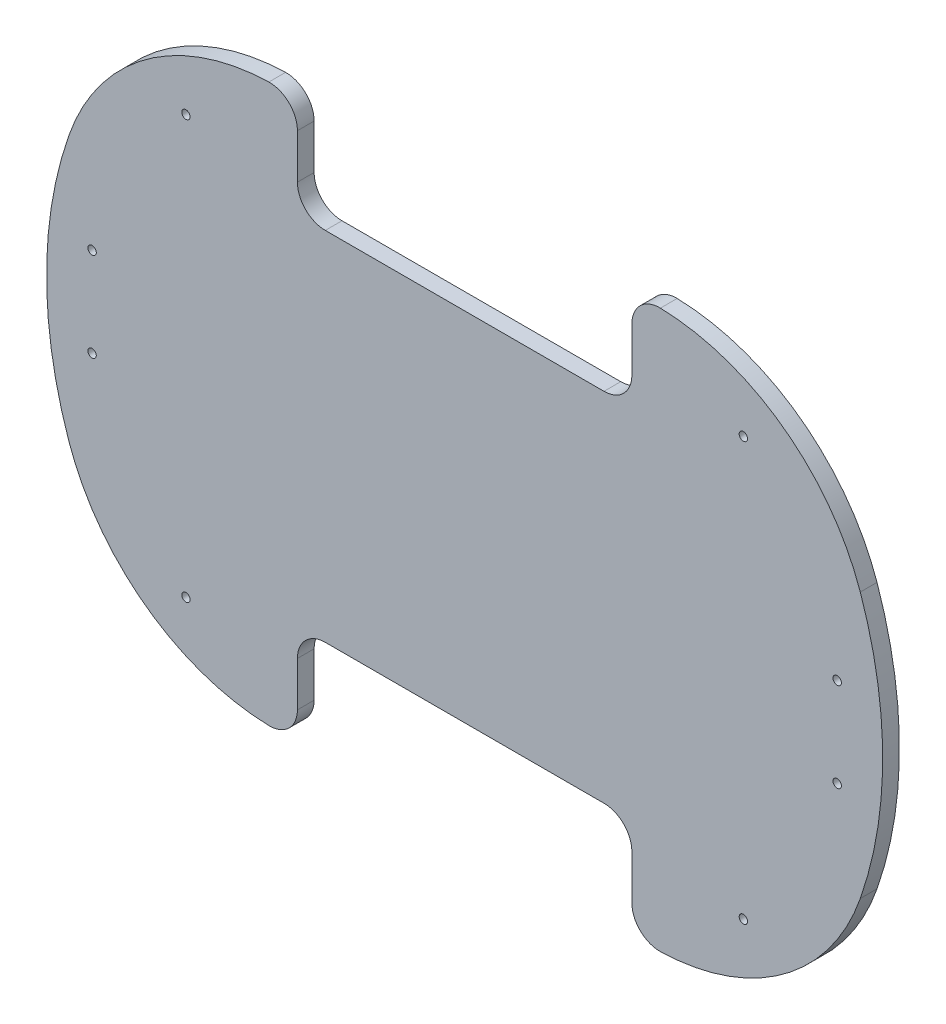
ISO-10303-21;
HEADER;
FILE_DESCRIPTION(('STEP AP214'),'2;1');
FILE_NAME('part.step','',(''),(''),'','','');
FILE_SCHEMA(('AUTOMOTIVE_DESIGN { 1 0 10303 214 1 1 1 1 }'));
ENDSEC;
DATA;
#1=APPLICATION_CONTEXT('core data for automotive mechanical design processes');
#2=APPLICATION_PROTOCOL_DEFINITION('international standard','automotive_design',2000,#1);
#3=PRODUCT_CONTEXT('',#1,'mechanical');
#4=PRODUCT('Part','Part','',(#3));
#5=PRODUCT_RELATED_PRODUCT_CATEGORY('part','',(#4));
#6=PRODUCT_DEFINITION_FORMATION('','',#4);
#7=PRODUCT_DEFINITION_CONTEXT('part definition',#1,'design');
#8=PRODUCT_DEFINITION('design','',#6,#7);
#9=PRODUCT_DEFINITION_SHAPE('','',#8);
#10=(LENGTH_UNIT() NAMED_UNIT(*) SI_UNIT(.MILLI.,.METRE.));
#11=(NAMED_UNIT(*) PLANE_ANGLE_UNIT() SI_UNIT($,.RADIAN.));
#12=(NAMED_UNIT(*) SI_UNIT($,.STERADIAN.) SOLID_ANGLE_UNIT());
#13=UNCERTAINTY_MEASURE_WITH_UNIT(LENGTH_MEASURE(1.E-05),#10,'distance_accuracy_value','');
#14=(GEOMETRIC_REPRESENTATION_CONTEXT(3) GLOBAL_UNCERTAINTY_ASSIGNED_CONTEXT((#13)) GLOBAL_UNIT_ASSIGNED_CONTEXT((#10,
#11,#12)) REPRESENTATION_CONTEXT('',''));
#15=CARTESIAN_POINT('',(0.,0.,0.));
#16=DIRECTION('',(0.,0.,1.));
#17=DIRECTION('',(1.,0.,0.));
#18=AXIS2_PLACEMENT_3D('',#15,#16,#17);
#19=CARTESIAN_POINT('',(-2.49999999999998,0.,3.));
#20=DIRECTION('',(0.,0.,-1.));
#21=DIRECTION('',(-1.,0.,0.));
#22=AXIS2_PLACEMENT_3D('',#19,#20,#21);
#23=CYLINDRICAL_SURFACE('',#22,72.5);
#24=CARTESIAN_POINT('',(-2.49999999999998,0.,0.));
#25=DIRECTION('',(0.,0.,1.));
#26=DIRECTION('',(1.,0.,0.));
#27=AXIS2_PLACEMENT_3D('',#24,#25,#26);
#28=CIRCLE('',#27,72.5);
#29=CARTESIAN_POINT('',(-70.9801123338217,23.8059701492537,0.));
#30=VERTEX_POINT('',#29);
#31=CARTESIAN_POINT('',(-70.9801123338217,-23.8059701492537,0.));
#32=VERTEX_POINT('',#31);
#33=EDGE_CURVE('E388',#30,#32,#28,.T.);
#34=ORIENTED_EDGE('',*,*,#33,.T.);
#35=DIRECTION('',(0.,0.,-1.));
#36=VECTOR('',#35,1.);
#37=CARTESIAN_POINT('',(-70.9801123338217,-23.8059701492537,3.));
#38=LINE('',#37,#36);
#39=CARTESIAN_POINT('',(-70.9801123338217,-23.8059701492537,3.));
#40=VERTEX_POINT('',#39);
#41=EDGE_CURVE('E246',#32,#40,#38,.F.);
#42=ORIENTED_EDGE('',*,*,#41,.T.);
#43=CARTESIAN_POINT('',(-2.49999999999998,0.,3.));
#44=DIRECTION('',(0.,0.,1.));
#45=DIRECTION('',(1.,0.,0.));
#46=AXIS2_PLACEMENT_3D('',#43,#44,#45);
#47=CIRCLE('',#46,72.5);
#48=CARTESIAN_POINT('',(-70.9801123338217,23.8059701492537,3.));
#49=VERTEX_POINT('',#48);
#50=EDGE_CURVE('E405',#49,#40,#47,.T.);
#51=ORIENTED_EDGE('',*,*,#50,.F.);
#52=DIRECTION('',(0.,0.,-1.));
#53=VECTOR('',#52,1.);
#54=CARTESIAN_POINT('',(-70.9801123338217,23.8059701492537,3.));
#55=LINE('',#54,#53);
#56=EDGE_CURVE('E242',#49,#30,#55,.T.);
#57=ORIENTED_EDGE('',*,*,#56,.T.);
#58=EDGE_LOOP('',(#34,#42,#51,#57));
#59=FACE_BOUND('',#58,.T.);
#60=ADVANCED_FACE('F40',(#59),#23,.T.);
#61=CARTESIAN_POINT('',(-30.,0.,3.));
#62=DIRECTION('',(-1.,0.,0.));
#63=DIRECTION('',(0.,-1.,0.));
#64=AXIS2_PLACEMENT_3D('',#61,#62,#63);
#65=PLANE('',#64);
#66=DIRECTION('',(0.,1.,0.));
#67=VECTOR('',#66,1.);
#68=CARTESIAN_POINT('',(-30.,0.,0.));
#69=LINE('',#68,#67);
#70=CARTESIAN_POINT('',(-30.,-44.9891858272389,0.));
#71=VERTEX_POINT('',#70);
#72=CARTESIAN_POINT('',(-30.,-37.,0.));
#73=VERTEX_POINT('',#72);
#74=EDGE_CURVE('E358',#71,#73,#69,.T.);
#75=ORIENTED_EDGE('',*,*,#74,.T.);
#76=DIRECTION('',(0.,0.,-1.));
#77=VECTOR('',#76,1.);
#78=CARTESIAN_POINT('',(-30.,-37.,3.));
#79=LINE('',#78,#77);
#80=CARTESIAN_POINT('',(-30.,-37.,3.));
#81=VERTEX_POINT('',#80);
#82=EDGE_CURVE('E281',#73,#81,#79,.F.);
#83=ORIENTED_EDGE('',*,*,#82,.T.);
#84=DIRECTION('',(0.,1.,0.));
#85=VECTOR('',#84,1.);
#86=CARTESIAN_POINT('',(-30.,0.,3.));
#87=LINE('',#86,#85);
#88=CARTESIAN_POINT('',(-30.,-44.9891858272389,3.));
#89=VERTEX_POINT('',#88);
#90=EDGE_CURVE('E378',#89,#81,#87,.T.);
#91=ORIENTED_EDGE('',*,*,#90,.F.);
#92=DIRECTION('',(0.,0.,1.));
#93=VECTOR('',#92,1.);
#94=CARTESIAN_POINT('',(-30.,-44.9891858272389,0.));
#95=LINE('',#94,#93);
#96=EDGE_CURVE('E277',#89,#71,#95,.F.);
#97=ORIENTED_EDGE('',*,*,#96,.T.);
#98=EDGE_LOOP('',(#75,#83,#91,#97));
#99=FACE_BOUND('',#98,.T.);
#100=ADVANCED_FACE('F520',(#99),#65,.F.);
#101=CARTESIAN_POINT('',(0.,-32.,3.));
#102=DIRECTION('',(0.,1.,0.));
#103=DIRECTION('',(0.,0.,1.));
#104=AXIS2_PLACEMENT_3D('',#101,#102,#103);
#105=PLANE('',#104);
#106=DIRECTION('',(1.,0.,0.));
#107=VECTOR('',#106,1.);
#108=CARTESIAN_POINT('',(0.,-32.,3.));
#109=LINE('',#108,#107);
#110=CARTESIAN_POINT('',(-25.,-32.,3.));
#111=VERTEX_POINT('',#110);
#112=CARTESIAN_POINT('',(25.,-32.,3.));
#113=VERTEX_POINT('',#112);
#114=EDGE_CURVE('E367',#111,#113,#109,.T.);
#115=ORIENTED_EDGE('',*,*,#114,.F.);
#116=DIRECTION('',(0.,0.,-1.));
#117=VECTOR('',#116,1.);
#118=CARTESIAN_POINT('',(-25.,-32.,0.));
#119=LINE('',#118,#117);
#120=CARTESIAN_POINT('',(-25.,-32.,0.));
#121=VERTEX_POINT('',#120);
#122=EDGE_CURVE('E273',#111,#121,#119,.T.);
#123=ORIENTED_EDGE('',*,*,#122,.T.);
#124=DIRECTION('',(1.,0.,0.));
#125=VECTOR('',#124,1.);
#126=CARTESIAN_POINT('',(0.,-32.,0.));
#127=LINE('',#126,#125);
#128=CARTESIAN_POINT('',(25.,-32.,0.));
#129=VERTEX_POINT('',#128);
#130=EDGE_CURVE('E347',#121,#129,#127,.T.);
#131=ORIENTED_EDGE('',*,*,#130,.T.);
#132=DIRECTION('',(0.,0.,-1.));
#133=VECTOR('',#132,1.);
#134=CARTESIAN_POINT('',(25.,-32.,3.));
#135=LINE('',#134,#133);
#136=EDGE_CURVE('E270',#129,#113,#135,.F.);
#137=ORIENTED_EDGE('',*,*,#136,.T.);
#138=EDGE_LOOP('',(#115,#123,#131,#137));
#139=FACE_BOUND('',#138,.T.);
#140=ADVANCED_FACE('F354',(#139),#105,.F.);
#141=CARTESIAN_POINT('',(30.,0.,3.));
#142=DIRECTION('',(1.,0.,0.));
#143=DIRECTION('',(0.,0.,-1.));
#144=AXIS2_PLACEMENT_3D('',#141,#142,#143);
#145=PLANE('',#144);
#146=DIRECTION('',(0.,-1.,0.));
#147=VECTOR('',#146,1.);
#148=CARTESIAN_POINT('',(30.,0.,3.));
#149=LINE('',#148,#147);
#150=CARTESIAN_POINT('',(30.,-37.,3.));
#151=VERTEX_POINT('',#150);
#152=CARTESIAN_POINT('',(30.,-44.9891858272389,3.));
#153=VERTEX_POINT('',#152);
#154=EDGE_CURVE('E365',#151,#153,#149,.T.);
#155=ORIENTED_EDGE('',*,*,#154,.F.);
#156=DIRECTION('',(0.,0.,-1.));
#157=VECTOR('',#156,1.);
#158=CARTESIAN_POINT('',(30.,-37.,0.));
#159=LINE('',#158,#157);
#160=CARTESIAN_POINT('',(30.,-37.,0.));
#161=VERTEX_POINT('',#160);
#162=EDGE_CURVE('E287',#151,#161,#159,.T.);
#163=ORIENTED_EDGE('',*,*,#162,.T.);
#164=DIRECTION('',(0.,-1.,0.));
#165=VECTOR('',#164,1.);
#166=CARTESIAN_POINT('',(30.,0.,0.));
#167=LINE('',#166,#165);
#168=CARTESIAN_POINT('',(30.,-44.9891858272389,0.));
#169=VERTEX_POINT('',#168);
#170=EDGE_CURVE('E204',#161,#169,#167,.T.);
#171=ORIENTED_EDGE('',*,*,#170,.T.);
#172=DIRECTION('',(0.,0.,1.));
#173=VECTOR('',#172,1.);
#174=CARTESIAN_POINT('',(30.,-44.9891858272389,3.));
#175=LINE('',#174,#173);
#176=EDGE_CURVE('E284',#169,#153,#175,.T.);
#177=ORIENTED_EDGE('',*,*,#176,.T.);
#178=EDGE_LOOP('',(#155,#163,#171,#177));
#179=FACE_BOUND('',#178,.T.);
#180=ADVANCED_FACE('F369',(#179),#145,.F.);
#181=CARTESIAN_POINT('',(2.5,0.,3.));
#182=DIRECTION('',(0.,0.,-1.));
#183=DIRECTION('',(-1.,0.,0.));
#184=AXIS2_PLACEMENT_3D('',#181,#182,#183);
#185=CYLINDRICAL_SURFACE('',#184,72.5);
#186=CARTESIAN_POINT('',(2.5,0.,3.));
#187=DIRECTION('',(0.,0.,1.));
#188=DIRECTION('',(1.,0.,0.));
#189=AXIS2_PLACEMENT_3D('',#186,#187,#188);
#190=CIRCLE('',#189,72.5);
#191=CARTESIAN_POINT('',(70.9801123338217,23.8059701492537,3.));
#192=VERTEX_POINT('',#191);
#193=CARTESIAN_POINT('',(70.9801123338217,-23.8059701492537,3.));
#194=VERTEX_POINT('',#193);
#195=EDGE_CURVE('E372',#192,#194,#190,.F.);
#196=ORIENTED_EDGE('',*,*,#195,.T.);
#197=DIRECTION('',(0.,0.,-1.));
#198=VECTOR('',#197,1.);
#199=CARTESIAN_POINT('',(70.9801123338217,-23.8059701492537,3.));
#200=LINE('',#199,#198);
#201=CARTESIAN_POINT('',(70.9801123338217,-23.8059701492537,0.));
#202=VERTEX_POINT('',#201);
#203=EDGE_CURVE('E201',#194,#202,#200,.T.);
#204=ORIENTED_EDGE('',*,*,#203,.T.);
#205=CARTESIAN_POINT('',(2.5,0.,0.));
#206=DIRECTION('',(0.,0.,1.));
#207=DIRECTION('',(1.,0.,0.));
#208=AXIS2_PLACEMENT_3D('',#205,#206,#207);
#209=CIRCLE('',#208,72.5);
#210=CARTESIAN_POINT('',(70.9801123338217,23.8059701492537,0.));
#211=VERTEX_POINT('',#210);
#212=EDGE_CURVE('E184',#211,#202,#209,.F.);
#213=ORIENTED_EDGE('',*,*,#212,.F.);
#214=DIRECTION('',(0.,0.,-1.));
#215=VECTOR('',#214,1.);
#216=CARTESIAN_POINT('',(70.9801123338217,23.8059701492537,3.));
#217=LINE('',#216,#215);
#218=EDGE_CURVE('E198',#211,#192,#217,.F.);
#219=ORIENTED_EDGE('',*,*,#218,.T.);
#220=EDGE_LOOP('',(#196,#204,#213,#219));
#221=FACE_BOUND('',#220,.T.);
#222=ADVANCED_FACE('F197',(#221),#185,.T.);
#223=CARTESIAN_POINT('',(30.,0.,3.));
#224=DIRECTION('',(-1.,0.,0.));
#225=DIRECTION('',(0.,0.,1.));
#226=AXIS2_PLACEMENT_3D('',#223,#224,#225);
#227=PLANE('',#226);
#228=DIRECTION('',(0.,1.,0.));
#229=VECTOR('',#228,1.);
#230=CARTESIAN_POINT('',(30.,0.,0.));
#231=LINE('',#230,#229);
#232=CARTESIAN_POINT('',(30.,37.,0.));
#233=VERTEX_POINT('',#232);
#234=CARTESIAN_POINT('',(30.,44.9891858272389,0.));
#235=VERTEX_POINT('',#234);
#236=EDGE_CURVE('E203',#233,#235,#231,.T.);
#237=ORIENTED_EDGE('',*,*,#236,.F.);
#238=DIRECTION('',(0.,0.,-1.));
#239=VECTOR('',#238,1.);
#240=CARTESIAN_POINT('',(30.,37.,3.));
#241=LINE('',#240,#239);
#242=CARTESIAN_POINT('',(30.,37.,3.));
#243=VERTEX_POINT('',#242);
#244=EDGE_CURVE('E260',#233,#243,#241,.F.);
#245=ORIENTED_EDGE('',*,*,#244,.T.);
#246=DIRECTION('',(0.,1.,0.));
#247=VECTOR('',#246,1.);
#248=CARTESIAN_POINT('',(30.,0.,3.));
#249=LINE('',#248,#247);
#250=CARTESIAN_POINT('',(30.,44.9891858272389,3.));
#251=VERTEX_POINT('',#250);
#252=EDGE_CURVE('E376',#243,#251,#249,.T.);
#253=ORIENTED_EDGE('',*,*,#252,.T.);
#254=DIRECTION('',(0.,0.,-1.));
#255=VECTOR('',#254,1.);
#256=CARTESIAN_POINT('',(30.,44.9891858272389,3.));
#257=LINE('',#256,#255);
#258=EDGE_CURVE('E256',#251,#235,#257,.T.);
#259=ORIENTED_EDGE('',*,*,#258,.T.);
#260=EDGE_LOOP('',(#237,#245,#253,#259));
#261=FACE_BOUND('',#260,.T.);
#262=ADVANCED_FACE('F574',(#261),#227,.T.);
#263=CARTESIAN_POINT('',(0.,32.,3.));
#264=DIRECTION('',(0.,1.,0.));
#265=DIRECTION('',(0.,0.,1.));
#266=AXIS2_PLACEMENT_3D('',#263,#264,#265);
#267=PLANE('',#266);
#268=DIRECTION('',(1.,0.,0.));
#269=VECTOR('',#268,1.);
#270=CARTESIAN_POINT('',(0.,32.,3.));
#271=LINE('',#270,#269);
#272=CARTESIAN_POINT('',(-25.,32.,3.));
#273=VERTEX_POINT('',#272);
#274=CARTESIAN_POINT('',(25.,32.,3.));
#275=VERTEX_POINT('',#274);
#276=EDGE_CURVE('E218',#273,#275,#271,.T.);
#277=ORIENTED_EDGE('',*,*,#276,.T.);
#278=DIRECTION('',(0.,0.,-1.));
#279=VECTOR('',#278,1.);
#280=CARTESIAN_POINT('',(25.,32.,0.));
#281=LINE('',#280,#279);
#282=CARTESIAN_POINT('',(25.,32.,0.));
#283=VERTEX_POINT('',#282);
#284=EDGE_CURVE('E252',#275,#283,#281,.T.);
#285=ORIENTED_EDGE('',*,*,#284,.T.);
#286=DIRECTION('',(1.,0.,0.));
#287=VECTOR('',#286,1.);
#288=CARTESIAN_POINT('',(0.,32.,0.));
#289=LINE('',#288,#287);
#290=CARTESIAN_POINT('',(-25.,32.,0.));
#291=VERTEX_POINT('',#290);
#292=EDGE_CURVE('E399',#291,#283,#289,.T.);
#293=ORIENTED_EDGE('',*,*,#292,.F.);
#294=DIRECTION('',(0.,0.,-1.));
#295=VECTOR('',#294,1.);
#296=CARTESIAN_POINT('',(-25.,32.,3.));
#297=LINE('',#296,#295);
#298=EDGE_CURVE('E249',#291,#273,#297,.F.);
#299=ORIENTED_EDGE('',*,*,#298,.T.);
#300=EDGE_LOOP('',(#277,#285,#293,#299));
#301=FACE_BOUND('',#300,.T.);
#302=ADVANCED_FACE('F580',(#301),#267,.T.);
#303=CARTESIAN_POINT('',(-30.,0.,3.));
#304=DIRECTION('',(1.,0.,0.));
#305=DIRECTION('',(0.,1.,0.));
#306=AXIS2_PLACEMENT_3D('',#303,#304,#305);
#307=PLANE('',#306);
#308=DIRECTION('',(0.,-1.,0.));
#309=VECTOR('',#308,1.);
#310=CARTESIAN_POINT('',(-30.,0.,3.));
#311=LINE('',#310,#309);
#312=CARTESIAN_POINT('',(-30.,44.9891858272389,3.));
#313=VERTEX_POINT('',#312);
#314=CARTESIAN_POINT('',(-30.,37.,3.));
#315=VERTEX_POINT('',#314);
#316=EDGE_CURVE('E211',#313,#315,#311,.T.);
#317=ORIENTED_EDGE('',*,*,#316,.T.);
#318=DIRECTION('',(0.,0.,-1.));
#319=VECTOR('',#318,1.);
#320=CARTESIAN_POINT('',(-30.,37.,0.));
#321=LINE('',#320,#319);
#322=CARTESIAN_POINT('',(-30.,37.,0.));
#323=VERTEX_POINT('',#322);
#324=EDGE_CURVE('E266',#315,#323,#321,.T.);
#325=ORIENTED_EDGE('',*,*,#324,.T.);
#326=DIRECTION('',(0.,-1.,0.));
#327=VECTOR('',#326,1.);
#328=CARTESIAN_POINT('',(-30.,0.,0.));
#329=LINE('',#328,#327);
#330=CARTESIAN_POINT('',(-30.,44.9891858272389,0.));
#331=VERTEX_POINT('',#330);
#332=EDGE_CURVE('E221',#331,#323,#329,.T.);
#333=ORIENTED_EDGE('',*,*,#332,.F.);
#334=DIRECTION('',(0.,0.,-1.));
#335=VECTOR('',#334,1.);
#336=CARTESIAN_POINT('',(-30.,44.9891858272389,3.));
#337=LINE('',#336,#335);
#338=EDGE_CURVE('E263',#331,#313,#337,.F.);
#339=ORIENTED_EDGE('',*,*,#338,.T.);
#340=EDGE_LOOP('',(#317,#325,#333,#339));
#341=FACE_BOUND('',#340,.T.);
#342=ADVANCED_FACE('F490',(#341),#307,.T.);
#343=CARTESIAN_POINT('',(0.,0.,3.));
#344=DIRECTION('',(0.,0.,1.));
#345=DIRECTION('',(1.,0.,0.));
#346=AXIS2_PLACEMENT_3D('',#343,#344,#345);
#347=PLANE('',#346);
#348=CARTESIAN_POINT('',(66.8309997598345,7.99999999999998,3.));
#349=DIRECTION('',(0.,0.,1.));
#350=DIRECTION('',(-1.,0.,0.));
#351=AXIS2_PLACEMENT_3D('',#348,#349,#350);
#352=CIRCLE('',#351,0.750000000000025);
#353=CARTESIAN_POINT('',(66.0809997598345,7.99999999999998,3.));
#354=VERTEX_POINT('',#353);
#355=EDGE_CURVE('E454',#354,#354,#352,.T.);
#356=ORIENTED_EDGE('',*,*,#355,.F.);
#357=EDGE_LOOP('',(#356));
#358=FACE_BOUND('',#357,.T.);
#359=CARTESIAN_POINT('',(66.8309997598345,-8.00000000000002,3.));
#360=DIRECTION('',(0.,0.,1.));
#361=DIRECTION('',(-1.,0.,0.));
#362=AXIS2_PLACEMENT_3D('',#359,#360,#361);
#363=CIRCLE('',#362,0.750000000000025);
#364=CARTESIAN_POINT('',(66.0809997598345,-8.00000000000002,3.));
#365=VERTEX_POINT('',#364);
#366=EDGE_CURVE('E462',#365,#365,#363,.T.);
#367=ORIENTED_EDGE('',*,*,#366,.F.);
#368=EDGE_LOOP('',(#367));
#369=FACE_BOUND('',#368,.T.);
#370=CARTESIAN_POINT('',(-66.8309997598345,-8.00000000000002,3.));
#371=DIRECTION('',(0.,0.,1.));
#372=DIRECTION('',(1.,0.,0.));
#373=AXIS2_PLACEMENT_3D('',#370,#371,#372);
#374=CIRCLE('',#373,0.749999999999999);
#375=CARTESIAN_POINT('',(-66.0809997598345,-8.00000000000002,3.));
#376=VERTEX_POINT('',#375);
#377=EDGE_CURVE('E470',#376,#376,#374,.T.);
#378=ORIENTED_EDGE('',*,*,#377,.F.);
#379=EDGE_LOOP('',(#378));
#380=FACE_BOUND('',#379,.T.);
#381=CARTESIAN_POINT('',(-66.8309997598345,7.99999999999998,3.));
#382=DIRECTION('',(0.,0.,1.));
#383=DIRECTION('',(1.,0.,0.));
#384=AXIS2_PLACEMENT_3D('',#381,#382,#383);
#385=CIRCLE('',#384,0.749999999999999);
#386=CARTESIAN_POINT('',(-66.0809997598345,7.99999999999998,3.));
#387=VERTEX_POINT('',#386);
#388=EDGE_CURVE('E446',#387,#387,#385,.T.);
#389=ORIENTED_EDGE('',*,*,#388,.F.);
#390=EDGE_LOOP('',(#389));
#391=FACE_BOUND('',#390,.T.);
#392=CARTESIAN_POINT('',(50.,37.5,3.));
#393=DIRECTION('',(0.,0.,1.));
#394=DIRECTION('',(1.,0.,0.));
#395=AXIS2_PLACEMENT_3D('',#392,#393,#394);
#396=CIRCLE('',#395,0.749999999999999);
#397=CARTESIAN_POINT('',(50.75,37.5,3.));
#398=VERTEX_POINT('',#397);
#399=EDGE_CURVE('E422',#398,#398,#396,.T.);
#400=ORIENTED_EDGE('',*,*,#399,.F.);
#401=EDGE_LOOP('',(#400));
#402=FACE_BOUND('',#401,.T.);
#403=CARTESIAN_POINT('',(50.,-37.5,3.));
#404=DIRECTION('',(0.,0.,1.));
#405=DIRECTION('',(1.,0.,0.));
#406=AXIS2_PLACEMENT_3D('',#403,#404,#405);
#407=CIRCLE('',#406,0.749999999999999);
#408=CARTESIAN_POINT('',(50.75,-37.5,3.));
#409=VERTEX_POINT('',#408);
#410=EDGE_CURVE('E431',#409,#409,#407,.T.);
#411=ORIENTED_EDGE('',*,*,#410,.F.);
#412=EDGE_LOOP('',(#411));
#413=FACE_BOUND('',#412,.T.);
#414=CARTESIAN_POINT('',(-50.,-37.5,3.));
#415=DIRECTION('',(0.,0.,1.));
#416=DIRECTION('',(1.,0.,0.));
#417=AXIS2_PLACEMENT_3D('',#414,#415,#416);
#418=CIRCLE('',#417,0.749999999999999);
#419=CARTESIAN_POINT('',(-49.25,-37.5,3.));
#420=VERTEX_POINT('',#419);
#421=EDGE_CURVE('E439',#420,#420,#418,.T.);
#422=ORIENTED_EDGE('',*,*,#421,.F.);
#423=EDGE_LOOP('',(#422));
#424=FACE_BOUND('',#423,.T.);
#425=CARTESIAN_POINT('',(-50.,37.5,3.));
#426=DIRECTION('',(0.,0.,1.));
#427=DIRECTION('',(1.,0.,0.));
#428=AXIS2_PLACEMENT_3D('',#425,#426,#427);
#429=CIRCLE('',#428,0.749999999999999);
#430=CARTESIAN_POINT('',(-49.25,37.5,3.));
#431=VERTEX_POINT('',#430);
#432=EDGE_CURVE('E414',#431,#431,#429,.T.);
#433=ORIENTED_EDGE('',*,*,#432,.F.);
#434=EDGE_LOOP('',(#433));
#435=FACE_BOUND('',#434,.T.);
#436=ORIENTED_EDGE('',*,*,#154,.T.);
#437=CARTESIAN_POINT('',(35.,-44.9891858272389,3.));
#438=DIRECTION('',(0.,0.,1.));
#439=DIRECTION('',(1.,0.,0.));
#440=AXIS2_PLACEMENT_3D('',#437,#438,#439);
#441=CIRCLE('',#440,5.);
#442=CARTESIAN_POINT('',(35.1260978434421,-49.9875955077152,3.));
#443=VERTEX_POINT('',#442);
#444=EDGE_CURVE('E314',#153,#443,#441,.T.);
#445=ORIENTED_EDGE('',*,*,#444,.T.);
#446=CARTESIAN_POINT('',(34.1425346645935,-11.,3.));
#447=DIRECTION('',(0.,0.,1.));
#448=DIRECTION('',(1.,0.,0.));
#449=AXIS2_PLACEMENT_3D('',#446,#447,#448);
#450=CIRCLE('',#449,39.);
#451=EDGE_CURVE('E239',#443,#194,#450,.T.);
#452=ORIENTED_EDGE('',*,*,#451,.T.);
#453=ORIENTED_EDGE('',*,*,#195,.F.);
#454=CARTESIAN_POINT('',(34.1425346645935,11.,3.));
#455=DIRECTION('',(0.,0.,1.));
#456=DIRECTION('',(1.,0.,0.));
#457=AXIS2_PLACEMENT_3D('',#454,#455,#456);
#458=CIRCLE('',#457,39.);
#459=CARTESIAN_POINT('',(35.1260978434421,49.9875955077152,3.));
#460=VERTEX_POINT('',#459);
#461=EDGE_CURVE('E209',#192,#460,#458,.T.);
#462=ORIENTED_EDGE('',*,*,#461,.T.);
#463=CARTESIAN_POINT('',(35.,44.9891858272389,3.));
#464=DIRECTION('',(0.,0.,1.));
#465=DIRECTION('',(1.,0.,0.));
#466=AXIS2_PLACEMENT_3D('',#463,#464,#465);
#467=CIRCLE('',#466,5.);
#468=EDGE_CURVE('E308',#460,#251,#467,.T.);
#469=ORIENTED_EDGE('',*,*,#468,.T.);
#470=ORIENTED_EDGE('',*,*,#252,.F.);
#471=CARTESIAN_POINT('',(25.,37.,3.));
#472=DIRECTION('',(0.,0.,1.));
#473=DIRECTION('',(1.,0.,0.));
#474=AXIS2_PLACEMENT_3D('',#471,#472,#473);
#475=CIRCLE('',#474,5.);
#476=EDGE_CURVE('E329',#243,#275,#475,.F.);
#477=ORIENTED_EDGE('',*,*,#476,.T.);
#478=ORIENTED_EDGE('',*,*,#276,.F.);
#479=CARTESIAN_POINT('',(-25.,37.,3.));
#480=DIRECTION('',(0.,0.,1.));
#481=DIRECTION('',(1.,0.,0.));
#482=AXIS2_PLACEMENT_3D('',#479,#480,#481);
#483=CIRCLE('',#482,5.);
#484=EDGE_CURVE('E335',#273,#315,#483,.F.);
#485=ORIENTED_EDGE('',*,*,#484,.T.);
#486=ORIENTED_EDGE('',*,*,#316,.F.);
#487=CARTESIAN_POINT('',(-35.,44.9891858272389,3.));
#488=DIRECTION('',(0.,0.,1.));
#489=DIRECTION('',(1.,0.,0.));
#490=AXIS2_PLACEMENT_3D('',#487,#488,#489);
#491=CIRCLE('',#490,5.);
#492=CARTESIAN_POINT('',(-35.1260978434421,49.9875955077152,3.));
#493=VERTEX_POINT('',#492);
#494=EDGE_CURVE('E64',#313,#493,#491,.T.);
#495=ORIENTED_EDGE('',*,*,#494,.T.);
#496=CARTESIAN_POINT('',(-34.1425346645935,11.,3.));
#497=DIRECTION('',(0.,0.,1.));
#498=DIRECTION('',(1.,0.,0.));
#499=AXIS2_PLACEMENT_3D('',#496,#497,#498);
#500=CIRCLE('',#499,39.);
#501=EDGE_CURVE('E231',#493,#49,#500,.T.);
#502=ORIENTED_EDGE('',*,*,#501,.T.);
#503=ORIENTED_EDGE('',*,*,#50,.T.);
#504=CARTESIAN_POINT('',(-34.1425346645935,-11.,3.));
#505=DIRECTION('',(0.,0.,1.));
#506=DIRECTION('',(1.,0.,0.));
#507=AXIS2_PLACEMENT_3D('',#504,#505,#506);
#508=CIRCLE('',#507,39.);
#509=CARTESIAN_POINT('',(-35.1260978434421,-49.9875955077152,3.));
#510=VERTEX_POINT('',#509);
#511=EDGE_CURVE('E234',#40,#510,#508,.T.);
#512=ORIENTED_EDGE('',*,*,#511,.T.);
#513=CARTESIAN_POINT('',(-35.,-44.9891858272389,3.));
#514=DIRECTION('',(0.,0.,1.));
#515=DIRECTION('',(1.,0.,0.));
#516=AXIS2_PLACEMENT_3D('',#513,#514,#515);
#517=CIRCLE('',#516,5.);
#518=EDGE_CURVE('E311',#510,#89,#517,.T.);
#519=ORIENTED_EDGE('',*,*,#518,.T.);
#520=ORIENTED_EDGE('',*,*,#90,.T.);
#521=CARTESIAN_POINT('',(-25.,-37.,3.));
#522=DIRECTION('',(0.,0.,1.));
#523=DIRECTION('',(1.,0.,0.));
#524=AXIS2_PLACEMENT_3D('',#521,#522,#523);
#525=CIRCLE('',#524,5.);
#526=EDGE_CURVE('E341',#81,#111,#525,.F.);
#527=ORIENTED_EDGE('',*,*,#526,.T.);
#528=ORIENTED_EDGE('',*,*,#114,.T.);
#529=CARTESIAN_POINT('',(25.,-37.,3.));
#530=DIRECTION('',(0.,0.,1.));
#531=DIRECTION('',(1.,0.,0.));
#532=AXIS2_PLACEMENT_3D('',#529,#530,#531);
#533=CIRCLE('',#532,5.);
#534=EDGE_CURVE('E11',#113,#151,#533,.F.);
#535=ORIENTED_EDGE('',*,*,#534,.T.);
#536=EDGE_LOOP('',(#436,#445,#452,#453,#462,#469,#470,#477,#478,#485,#486,#495,#502,#503,#512,
#519,#520,#527,#528,#535));
#537=FACE_BOUND('',#536,.T.);
#538=ADVANCED_FACE('F364',(#358,#369,#380,#391,#402,#413,#424,#435,#537),#347,.T.);
#539=CARTESIAN_POINT('',(0.,0.,0.));
#540=DIRECTION('',(0.,0.,1.));
#541=DIRECTION('',(1.,0.,0.));
#542=AXIS2_PLACEMENT_3D('',#539,#540,#541);
#543=PLANE('',#542);
#544=CARTESIAN_POINT('',(66.8309997598345,7.99999999999998,0.));
#545=DIRECTION('',(0.,0.,1.));
#546=DIRECTION('',(-1.,0.,0.));
#547=AXIS2_PLACEMENT_3D('',#544,#545,#546);
#548=CIRCLE('',#547,0.750000000000025);
#549=CARTESIAN_POINT('',(66.0809997598345,7.99999999999998,0.));
#550=VERTEX_POINT('',#549);
#551=EDGE_CURVE('E458',#550,#550,#548,.T.);
#552=ORIENTED_EDGE('',*,*,#551,.T.);
#553=EDGE_LOOP('',(#552));
#554=FACE_BOUND('',#553,.T.);
#555=CARTESIAN_POINT('',(66.8309997598345,-8.00000000000002,0.));
#556=DIRECTION('',(0.,0.,1.));
#557=DIRECTION('',(-1.,0.,0.));
#558=AXIS2_PLACEMENT_3D('',#555,#556,#557);
#559=CIRCLE('',#558,0.750000000000025);
#560=CARTESIAN_POINT('',(66.0809997598345,-8.00000000000002,0.));
#561=VERTEX_POINT('',#560);
#562=EDGE_CURVE('E466',#561,#561,#559,.T.);
#563=ORIENTED_EDGE('',*,*,#562,.T.);
#564=EDGE_LOOP('',(#563));
#565=FACE_BOUND('',#564,.T.);
#566=CARTESIAN_POINT('',(-66.8309997598345,-8.00000000000002,0.));
#567=DIRECTION('',(0.,0.,1.));
#568=DIRECTION('',(1.,0.,0.));
#569=AXIS2_PLACEMENT_3D('',#566,#567,#568);
#570=CIRCLE('',#569,0.749999999999999);
#571=CARTESIAN_POINT('',(-66.0809997598345,-8.00000000000002,0.));
#572=VERTEX_POINT('',#571);
#573=EDGE_CURVE('E450',#572,#572,#570,.T.);
#574=ORIENTED_EDGE('',*,*,#573,.T.);
#575=EDGE_LOOP('',(#574));
#576=FACE_BOUND('',#575,.T.);
#577=CARTESIAN_POINT('',(-66.8309997598345,7.99999999999998,0.));
#578=DIRECTION('',(0.,0.,1.));
#579=DIRECTION('',(1.,0.,0.));
#580=AXIS2_PLACEMENT_3D('',#577,#578,#579);
#581=CIRCLE('',#580,0.749999999999999);
#582=CARTESIAN_POINT('',(-66.0809997598345,7.99999999999998,0.));
#583=VERTEX_POINT('',#582);
#584=EDGE_CURVE('E427',#583,#583,#581,.T.);
#585=ORIENTED_EDGE('',*,*,#584,.T.);
#586=EDGE_LOOP('',(#585));
#587=FACE_BOUND('',#586,.T.);
#588=CARTESIAN_POINT('',(50.,37.5,0.));
#589=DIRECTION('',(0.,0.,1.));
#590=DIRECTION('',(1.,0.,0.));
#591=AXIS2_PLACEMENT_3D('',#588,#589,#590);
#592=CIRCLE('',#591,0.749999999999999);
#593=CARTESIAN_POINT('',(50.75,37.5,0.));
#594=VERTEX_POINT('',#593);
#595=EDGE_CURVE('E426',#594,#594,#592,.T.);
#596=ORIENTED_EDGE('',*,*,#595,.T.);
#597=EDGE_LOOP('',(#596));
#598=FACE_BOUND('',#597,.T.);
#599=CARTESIAN_POINT('',(50.,-37.5,0.));
#600=DIRECTION('',(0.,0.,1.));
#601=DIRECTION('',(1.,0.,0.));
#602=AXIS2_PLACEMENT_3D('',#599,#600,#601);
#603=CIRCLE('',#602,0.749999999999999);
#604=CARTESIAN_POINT('',(50.75,-37.5,0.));
#605=VERTEX_POINT('',#604);
#606=EDGE_CURVE('E435',#605,#605,#603,.T.);
#607=ORIENTED_EDGE('',*,*,#606,.T.);
#608=EDGE_LOOP('',(#607));
#609=FACE_BOUND('',#608,.T.);
#610=CARTESIAN_POINT('',(-50.,-37.5,0.));
#611=DIRECTION('',(0.,0.,1.));
#612=DIRECTION('',(1.,0.,0.));
#613=AXIS2_PLACEMENT_3D('',#610,#611,#612);
#614=CIRCLE('',#613,0.749999999999999);
#615=CARTESIAN_POINT('',(-49.25,-37.5,0.));
#616=VERTEX_POINT('',#615);
#617=EDGE_CURVE('E418',#616,#616,#614,.T.);
#618=ORIENTED_EDGE('',*,*,#617,.T.);
#619=EDGE_LOOP('',(#618));
#620=FACE_BOUND('',#619,.T.);
#621=CARTESIAN_POINT('',(-50.,37.5,0.));
#622=DIRECTION('',(0.,0.,1.));
#623=DIRECTION('',(1.,0.,0.));
#624=AXIS2_PLACEMENT_3D('',#621,#622,#623);
#625=CIRCLE('',#624,0.749999999999999);
#626=CARTESIAN_POINT('',(-49.25,37.5,0.));
#627=VERTEX_POINT('',#626);
#628=EDGE_CURVE('E392',#627,#627,#625,.T.);
#629=ORIENTED_EDGE('',*,*,#628,.T.);
#630=EDGE_LOOP('',(#629));
#631=FACE_BOUND('',#630,.T.);
#632=CARTESIAN_POINT('',(34.1425346645935,-11.,0.));
#633=DIRECTION('',(0.,0.,1.));
#634=DIRECTION('',(1.,0.,0.));
#635=AXIS2_PLACEMENT_3D('',#632,#633,#634);
#636=CIRCLE('',#635,39.);
#637=CARTESIAN_POINT('',(35.1260978434421,-49.9875955077152,0.));
#638=VERTEX_POINT('',#637);
#639=EDGE_CURVE('E191',#202,#638,#636,.F.);
#640=ORIENTED_EDGE('',*,*,#639,.T.);
#641=CARTESIAN_POINT('',(35.,-44.9891858272389,0.));
#642=DIRECTION('',(0.,0.,1.));
#643=DIRECTION('',(1.,0.,0.));
#644=AXIS2_PLACEMENT_3D('',#641,#642,#643);
#645=CIRCLE('',#644,5.);
#646=EDGE_CURVE('E303',#638,#169,#645,.F.);
#647=ORIENTED_EDGE('',*,*,#646,.T.);
#648=ORIENTED_EDGE('',*,*,#170,.F.);
#649=CARTESIAN_POINT('',(25.,-37.,0.));
#650=DIRECTION('',(0.,0.,1.));
#651=DIRECTION('',(1.,0.,0.));
#652=AXIS2_PLACEMENT_3D('',#649,#650,#651);
#653=CIRCLE('',#652,5.);
#654=EDGE_CURVE('E49',#161,#129,#653,.T.);
#655=ORIENTED_EDGE('',*,*,#654,.T.);
#656=ORIENTED_EDGE('',*,*,#130,.F.);
#657=CARTESIAN_POINT('',(-25.,-37.,0.));
#658=DIRECTION('',(0.,0.,1.));
#659=DIRECTION('',(1.,0.,0.));
#660=AXIS2_PLACEMENT_3D('',#657,#658,#659);
#661=CIRCLE('',#660,5.);
#662=EDGE_CURVE('E338',#121,#73,#661,.T.);
#663=ORIENTED_EDGE('',*,*,#662,.T.);
#664=ORIENTED_EDGE('',*,*,#74,.F.);
#665=CARTESIAN_POINT('',(-35.,-44.9891858272389,0.));
#666=DIRECTION('',(0.,0.,1.));
#667=DIRECTION('',(1.,0.,0.));
#668=AXIS2_PLACEMENT_3D('',#665,#666,#667);
#669=CIRCLE('',#668,5.);
#670=CARTESIAN_POINT('',(-35.1260978434421,-49.9875955077152,0.));
#671=VERTEX_POINT('',#670);
#672=EDGE_CURVE('E300',#71,#671,#669,.F.);
#673=ORIENTED_EDGE('',*,*,#672,.T.);
#674=CARTESIAN_POINT('',(-34.1425346645935,-11.,0.));
#675=DIRECTION('',(0.,0.,1.));
#676=DIRECTION('',(1.,0.,0.));
#677=AXIS2_PLACEMENT_3D('',#674,#675,#676);
#678=CIRCLE('',#677,39.);
#679=EDGE_CURVE('E192',#671,#32,#678,.F.);
#680=ORIENTED_EDGE('',*,*,#679,.T.);
#681=ORIENTED_EDGE('',*,*,#33,.F.);
#682=CARTESIAN_POINT('',(-34.1425346645935,11.,0.));
#683=DIRECTION('',(0.,0.,1.));
#684=DIRECTION('',(1.,0.,0.));
#685=AXIS2_PLACEMENT_3D('',#682,#683,#684);
#686=CIRCLE('',#685,39.);
#687=CARTESIAN_POINT('',(-35.1260978434421,49.9875955077152,0.));
#688=VERTEX_POINT('',#687);
#689=EDGE_CURVE('E215',#30,#688,#686,.F.);
#690=ORIENTED_EDGE('',*,*,#689,.T.);
#691=CARTESIAN_POINT('',(-35.,44.9891858272389,0.));
#692=DIRECTION('',(0.,0.,1.));
#693=DIRECTION('',(1.,0.,0.));
#694=AXIS2_PLACEMENT_3D('',#691,#692,#693);
#695=CIRCLE('',#694,5.);
#696=EDGE_CURVE('E295',#688,#331,#695,.F.);
#697=ORIENTED_EDGE('',*,*,#696,.T.);
#698=ORIENTED_EDGE('',*,*,#332,.T.);
#699=CARTESIAN_POINT('',(-25.,37.,0.));
#700=DIRECTION('',(0.,0.,1.));
#701=DIRECTION('',(1.,0.,0.));
#702=AXIS2_PLACEMENT_3D('',#699,#700,#701);
#703=CIRCLE('',#702,5.);
#704=EDGE_CURVE('E332',#323,#291,#703,.T.);
#705=ORIENTED_EDGE('',*,*,#704,.T.);
#706=ORIENTED_EDGE('',*,*,#292,.T.);
#707=CARTESIAN_POINT('',(25.,37.,0.));
#708=DIRECTION('',(0.,0.,1.));
#709=DIRECTION('',(1.,0.,0.));
#710=AXIS2_PLACEMENT_3D('',#707,#708,#709);
#711=CIRCLE('',#710,5.);
#712=EDGE_CURVE('E326',#283,#233,#711,.T.);
#713=ORIENTED_EDGE('',*,*,#712,.T.);
#714=ORIENTED_EDGE('',*,*,#236,.T.);
#715=CARTESIAN_POINT('',(35.,44.9891858272389,0.));
#716=DIRECTION('',(0.,0.,1.));
#717=DIRECTION('',(1.,0.,0.));
#718=AXIS2_PLACEMENT_3D('',#715,#716,#717);
#719=CIRCLE('',#718,5.);
#720=CARTESIAN_POINT('',(35.1260978434421,49.9875955077152,0.));
#721=VERTEX_POINT('',#720);
#722=EDGE_CURVE('E186',#235,#721,#719,.F.);
#723=ORIENTED_EDGE('',*,*,#722,.T.);
#724=CARTESIAN_POINT('',(34.1425346645935,11.,0.));
#725=DIRECTION('',(0.,0.,1.));
#726=DIRECTION('',(1.,0.,0.));
#727=AXIS2_PLACEMENT_3D('',#724,#725,#726);
#728=CIRCLE('',#727,39.);
#729=EDGE_CURVE('E180',#721,#211,#728,.F.);
#730=ORIENTED_EDGE('',*,*,#729,.T.);
#731=ORIENTED_EDGE('',*,*,#212,.T.);
#732=EDGE_LOOP('',(#640,#647,#648,#655,#656,#663,#664,#673,#680,#681,#690,#697,#698,#705,#706,
#713,#714,#723,#730,#731));
#733=FACE_BOUND('',#732,.T.);
#734=ADVANCED_FACE('F183',(#554,#565,#576,#587,#598,#609,#620,#631,#733),#543,.F.);
#735=CARTESIAN_POINT('',(34.1425346645935,-11.,3.));
#736=DIRECTION('',(0.,0.,-1.));
#737=DIRECTION('',(-1.,0.,0.));
#738=AXIS2_PLACEMENT_3D('',#735,#736,#737);
#739=CYLINDRICAL_SURFACE('',#738,39.);
#740=ORIENTED_EDGE('',*,*,#451,.F.);
#741=DIRECTION('',(0.,0.,-1.));
#742=VECTOR('',#741,1.);
#743=CARTESIAN_POINT('',(35.1260978434421,-49.9875955077152,3.));
#744=LINE('',#743,#742);
#745=EDGE_CURVE('E291',#443,#638,#744,.T.);
#746=ORIENTED_EDGE('',*,*,#745,.T.);
#747=ORIENTED_EDGE('',*,*,#639,.F.);
#748=ORIENTED_EDGE('',*,*,#203,.F.);
#749=EDGE_LOOP('',(#740,#746,#747,#748));
#750=FACE_BOUND('',#749,.T.);
#751=ADVANCED_FACE('F530',(#750),#739,.T.);
#752=CARTESIAN_POINT('',(34.1425346645935,11.,3.));
#753=DIRECTION('',(0.,0.,-1.));
#754=DIRECTION('',(-1.,0.,0.));
#755=AXIS2_PLACEMENT_3D('',#752,#753,#754);
#756=CYLINDRICAL_SURFACE('',#755,39.);
#757=ORIENTED_EDGE('',*,*,#729,.F.);
#758=DIRECTION('',(0.,0.,-1.));
#759=VECTOR('',#758,1.);
#760=CARTESIAN_POINT('',(35.1260978434421,49.9875955077152,3.));
#761=LINE('',#760,#759);
#762=EDGE_CURVE('E319',#721,#460,#761,.F.);
#763=ORIENTED_EDGE('',*,*,#762,.T.);
#764=ORIENTED_EDGE('',*,*,#461,.F.);
#765=ORIENTED_EDGE('',*,*,#218,.F.);
#766=EDGE_LOOP('',(#757,#763,#764,#765));
#767=FACE_BOUND('',#766,.T.);
#768=ADVANCED_FACE('F207',(#767),#756,.T.);
#769=CARTESIAN_POINT('',(-34.1425346645935,-11.,3.));
#770=DIRECTION('',(0.,0.,-1.));
#771=DIRECTION('',(-1.,0.,0.));
#772=AXIS2_PLACEMENT_3D('',#769,#770,#771);
#773=CYLINDRICAL_SURFACE('',#772,39.);
#774=ORIENTED_EDGE('',*,*,#679,.F.);
#775=DIRECTION('',(0.,0.,-1.));
#776=VECTOR('',#775,1.);
#777=CARTESIAN_POINT('',(-35.1260978434421,-49.9875955077152,3.));
#778=LINE('',#777,#776);
#779=EDGE_CURVE('E56',#671,#510,#778,.F.);
#780=ORIENTED_EDGE('',*,*,#779,.T.);
#781=ORIENTED_EDGE('',*,*,#511,.F.);
#782=ORIENTED_EDGE('',*,*,#41,.F.);
#783=EDGE_LOOP('',(#774,#780,#781,#782));
#784=FACE_BOUND('',#783,.T.);
#785=ADVANCED_FACE('F536',(#784),#773,.T.);
#786=CARTESIAN_POINT('',(-34.1425346645935,11.,3.));
#787=DIRECTION('',(0.,0.,-1.));
#788=DIRECTION('',(-1.,0.,0.));
#789=AXIS2_PLACEMENT_3D('',#786,#787,#788);
#790=CYLINDRICAL_SURFACE('',#789,39.);
#791=ORIENTED_EDGE('',*,*,#501,.F.);
#792=DIRECTION('',(0.,0.,-1.));
#793=VECTOR('',#792,1.);
#794=CARTESIAN_POINT('',(-35.1260978434421,49.9875955077152,3.));
#795=LINE('',#794,#793);
#796=EDGE_CURVE('E322',#493,#688,#795,.T.);
#797=ORIENTED_EDGE('',*,*,#796,.T.);
#798=ORIENTED_EDGE('',*,*,#689,.F.);
#799=ORIENTED_EDGE('',*,*,#56,.F.);
#800=EDGE_LOOP('',(#791,#797,#798,#799));
#801=FACE_BOUND('',#800,.T.);
#802=ADVANCED_FACE('F539',(#801),#790,.T.);
#803=CARTESIAN_POINT('',(25.,37.,3.));
#804=DIRECTION('',(0.,0.,1.));
#805=DIRECTION('',(1.,0.,0.));
#806=AXIS2_PLACEMENT_3D('',#803,#804,#805);
#807=CYLINDRICAL_SURFACE('',#806,5.);
#808=ORIENTED_EDGE('',*,*,#476,.F.);
#809=ORIENTED_EDGE('',*,*,#244,.F.);
#810=ORIENTED_EDGE('',*,*,#712,.F.);
#811=ORIENTED_EDGE('',*,*,#284,.F.);
#812=EDGE_LOOP('',(#808,#809,#810,#811));
#813=FACE_BOUND('',#812,.T.);
#814=ADVANCED_FACE('F542',(#813),#807,.F.);
#815=CARTESIAN_POINT('',(-25.,37.,3.));
#816=DIRECTION('',(0.,0.,1.));
#817=DIRECTION('',(1.,0.,0.));
#818=AXIS2_PLACEMENT_3D('',#815,#816,#817);
#819=CYLINDRICAL_SURFACE('',#818,5.);
#820=ORIENTED_EDGE('',*,*,#484,.F.);
#821=ORIENTED_EDGE('',*,*,#298,.F.);
#822=ORIENTED_EDGE('',*,*,#704,.F.);
#823=ORIENTED_EDGE('',*,*,#324,.F.);
#824=EDGE_LOOP('',(#820,#821,#822,#823));
#825=FACE_BOUND('',#824,.T.);
#826=ADVANCED_FACE('F546',(#825),#819,.F.);
#827=CARTESIAN_POINT('',(-25.,-37.,3.));
#828=DIRECTION('',(0.,0.,1.));
#829=DIRECTION('',(1.,0.,0.));
#830=AXIS2_PLACEMENT_3D('',#827,#828,#829);
#831=CYLINDRICAL_SURFACE('',#830,5.);
#832=ORIENTED_EDGE('',*,*,#526,.F.);
#833=ORIENTED_EDGE('',*,*,#82,.F.);
#834=ORIENTED_EDGE('',*,*,#662,.F.);
#835=ORIENTED_EDGE('',*,*,#122,.F.);
#836=EDGE_LOOP('',(#832,#833,#834,#835));
#837=FACE_BOUND('',#836,.T.);
#838=ADVANCED_FACE('F550',(#837),#831,.F.);
#839=CARTESIAN_POINT('',(25.,-37.,3.));
#840=DIRECTION('',(0.,0.,1.));
#841=DIRECTION('',(1.,0.,0.));
#842=AXIS2_PLACEMENT_3D('',#839,#840,#841);
#843=CYLINDRICAL_SURFACE('',#842,5.);
#844=ORIENTED_EDGE('',*,*,#534,.F.);
#845=ORIENTED_EDGE('',*,*,#136,.F.);
#846=ORIENTED_EDGE('',*,*,#654,.F.);
#847=ORIENTED_EDGE('',*,*,#162,.F.);
#848=EDGE_LOOP('',(#844,#845,#846,#847));
#849=FACE_BOUND('',#848,.T.);
#850=ADVANCED_FACE('F361',(#849),#843,.F.);
#851=CARTESIAN_POINT('',(35.,-44.9891858272389,3.));
#852=DIRECTION('',(0.,0.,-1.));
#853=DIRECTION('',(-1.,0.,0.));
#854=AXIS2_PLACEMENT_3D('',#851,#852,#853);
#855=CYLINDRICAL_SURFACE('',#854,5.);
#856=ORIENTED_EDGE('',*,*,#444,.F.);
#857=ORIENTED_EDGE('',*,*,#176,.F.);
#858=ORIENTED_EDGE('',*,*,#646,.F.);
#859=ORIENTED_EDGE('',*,*,#745,.F.);
#860=EDGE_LOOP('',(#856,#857,#858,#859));
#861=FACE_BOUND('',#860,.T.);
#862=ADVANCED_FACE('F557',(#861),#855,.T.);
#863=CARTESIAN_POINT('',(-35.,-44.9891858272389,3.));
#864=DIRECTION('',(0.,0.,-1.));
#865=DIRECTION('',(-1.,0.,0.));
#866=AXIS2_PLACEMENT_3D('',#863,#864,#865);
#867=CYLINDRICAL_SURFACE('',#866,5.);
#868=ORIENTED_EDGE('',*,*,#518,.F.);
#869=ORIENTED_EDGE('',*,*,#779,.F.);
#870=ORIENTED_EDGE('',*,*,#672,.F.);
#871=ORIENTED_EDGE('',*,*,#96,.F.);
#872=EDGE_LOOP('',(#868,#869,#870,#871));
#873=FACE_BOUND('',#872,.T.);
#874=ADVANCED_FACE('F560',(#873),#867,.T.);
#875=CARTESIAN_POINT('',(35.,44.9891858272389,3.));
#876=DIRECTION('',(0.,0.,-1.));
#877=DIRECTION('',(-1.,0.,0.));
#878=AXIS2_PLACEMENT_3D('',#875,#876,#877);
#879=CYLINDRICAL_SURFACE('',#878,5.);
#880=ORIENTED_EDGE('',*,*,#468,.F.);
#881=ORIENTED_EDGE('',*,*,#762,.F.);
#882=ORIENTED_EDGE('',*,*,#722,.F.);
#883=ORIENTED_EDGE('',*,*,#258,.F.);
#884=EDGE_LOOP('',(#880,#881,#882,#883));
#885=FACE_BOUND('',#884,.T.);
#886=ADVANCED_FACE('F515',(#885),#879,.T.);
#887=CARTESIAN_POINT('',(-35.,44.9891858272389,3.));
#888=DIRECTION('',(0.,0.,-1.));
#889=DIRECTION('',(-1.,0.,0.));
#890=AXIS2_PLACEMENT_3D('',#887,#888,#889);
#891=CYLINDRICAL_SURFACE('',#890,5.);
#892=ORIENTED_EDGE('',*,*,#494,.F.);
#893=ORIENTED_EDGE('',*,*,#338,.F.);
#894=ORIENTED_EDGE('',*,*,#696,.F.);
#895=ORIENTED_EDGE('',*,*,#796,.F.);
#896=EDGE_LOOP('',(#892,#893,#894,#895));
#897=FACE_BOUND('',#896,.T.);
#898=ADVANCED_FACE('F42',(#897),#891,.T.);
#899=CARTESIAN_POINT('',(-50.,37.5,0.));
#900=DIRECTION('',(0.,0.,1.));
#901=DIRECTION('',(1.,0.,0.));
#902=AXIS2_PLACEMENT_3D('',#899,#900,#901);
#903=CYLINDRICAL_SURFACE('',#902,0.749999999999999);
#904=ORIENTED_EDGE('',*,*,#628,.F.);
#905=EDGE_LOOP('',(#904));
#906=FACE_BOUND('',#905,.T.);
#907=ORIENTED_EDGE('',*,*,#432,.T.);
#908=EDGE_LOOP('',(#907));
#909=FACE_BOUND('',#908,.T.);
#910=ADVANCED_FACE('F503',(#906,#909),#903,.F.);
#911=CARTESIAN_POINT('',(-50.,-37.5,0.));
#912=DIRECTION('',(0.,0.,1.));
#913=DIRECTION('',(1.,0.,0.));
#914=AXIS2_PLACEMENT_3D('',#911,#912,#913);
#915=CYLINDRICAL_SURFACE('',#914,0.749999999999999);
#916=ORIENTED_EDGE('',*,*,#617,.F.);
#917=EDGE_LOOP('',(#916));
#918=FACE_BOUND('',#917,.T.);
#919=ORIENTED_EDGE('',*,*,#421,.T.);
#920=EDGE_LOOP('',(#919));
#921=FACE_BOUND('',#920,.T.);
#922=ADVANCED_FACE('F505',(#918,#921),#915,.F.);
#923=CARTESIAN_POINT('',(50.,-37.5,0.));
#924=DIRECTION('',(0.,0.,1.));
#925=DIRECTION('',(1.,0.,0.));
#926=AXIS2_PLACEMENT_3D('',#923,#924,#925);
#927=CYLINDRICAL_SURFACE('',#926,0.749999999999999);
#928=ORIENTED_EDGE('',*,*,#606,.F.);
#929=EDGE_LOOP('',(#928));
#930=FACE_BOUND('',#929,.T.);
#931=ORIENTED_EDGE('',*,*,#410,.T.);
#932=EDGE_LOOP('',(#931));
#933=FACE_BOUND('',#932,.T.);
#934=ADVANCED_FACE('F512',(#930,#933),#927,.F.);
#935=CARTESIAN_POINT('',(50.,37.5,0.));
#936=DIRECTION('',(0.,0.,1.));
#937=DIRECTION('',(1.,0.,0.));
#938=AXIS2_PLACEMENT_3D('',#935,#936,#937);
#939=CYLINDRICAL_SURFACE('',#938,0.749999999999999);
#940=ORIENTED_EDGE('',*,*,#595,.F.);
#941=EDGE_LOOP('',(#940));
#942=FACE_BOUND('',#941,.T.);
#943=ORIENTED_EDGE('',*,*,#399,.T.);
#944=EDGE_LOOP('',(#943));
#945=FACE_BOUND('',#944,.T.);
#946=ADVANCED_FACE('F726',(#942,#945),#939,.F.);
#947=CARTESIAN_POINT('',(-66.8309997598345,7.99999999999998,0.));
#948=DIRECTION('',(0.,0.,1.));
#949=DIRECTION('',(1.,0.,0.));
#950=AXIS2_PLACEMENT_3D('',#947,#948,#949);
#951=CYLINDRICAL_SURFACE('',#950,0.749999999999999);
#952=ORIENTED_EDGE('',*,*,#584,.F.);
#953=EDGE_LOOP('',(#952));
#954=FACE_BOUND('',#953,.T.);
#955=ORIENTED_EDGE('',*,*,#388,.T.);
#956=EDGE_LOOP('',(#955));
#957=FACE_BOUND('',#956,.T.);
#958=ADVANCED_FACE('F484',(#954,#957),#951,.F.);
#959=CARTESIAN_POINT('',(-66.8309997598345,-8.00000000000002,0.));
#960=DIRECTION('',(0.,0.,1.));
#961=DIRECTION('',(1.,0.,0.));
#962=AXIS2_PLACEMENT_3D('',#959,#960,#961);
#963=CYLINDRICAL_SURFACE('',#962,0.749999999999999);
#964=ORIENTED_EDGE('',*,*,#573,.F.);
#965=EDGE_LOOP('',(#964));
#966=FACE_BOUND('',#965,.T.);
#967=ORIENTED_EDGE('',*,*,#377,.T.);
#968=EDGE_LOOP('',(#967));
#969=FACE_BOUND('',#968,.T.);
#970=ADVANCED_FACE('F480',(#966,#969),#963,.F.);
#971=CARTESIAN_POINT('',(66.8309997598345,-8.00000000000002,0.));
#972=DIRECTION('',(0.,0.,1.));
#973=DIRECTION('',(1.,0.,0.));
#974=AXIS2_PLACEMENT_3D('',#971,#972,#973);
#975=CYLINDRICAL_SURFACE('',#974,0.750000000000025);
#976=ORIENTED_EDGE('',*,*,#562,.F.);
#977=EDGE_LOOP('',(#976));
#978=FACE_BOUND('',#977,.T.);
#979=ORIENTED_EDGE('',*,*,#366,.T.);
#980=EDGE_LOOP('',(#979));
#981=FACE_BOUND('',#980,.T.);
#982=ADVANCED_FACE('F483',(#978,#981),#975,.F.);
#983=CARTESIAN_POINT('',(66.8309997598345,7.99999999999998,0.));
#984=DIRECTION('',(0.,0.,1.));
#985=DIRECTION('',(1.,0.,0.));
#986=AXIS2_PLACEMENT_3D('',#983,#984,#985);
#987=CYLINDRICAL_SURFACE('',#986,0.750000000000025);
#988=ORIENTED_EDGE('',*,*,#551,.F.);
#989=EDGE_LOOP('',(#988));
#990=FACE_BOUND('',#989,.T.);
#991=ORIENTED_EDGE('',*,*,#355,.T.);
#992=EDGE_LOOP('',(#991));
#993=FACE_BOUND('',#992,.T.);
#994=ADVANCED_FACE('F766',(#990,#993),#987,.F.);
#995=CLOSED_SHELL('',(#60,#100,#140,#180,#222,#262,#302,#342,#538,#734,#751,#768,#785,#802,#814,
#826,#838,#850,#862,#874,#886,#898,#910,#922,#934,#946,#958,#970,#982,#994));
#996=MANIFOLD_SOLID_BREP('B2',#995);
#997=ADVANCED_BREP_SHAPE_REPRESENTATION('',(#18,#996),#14);
#998=SHAPE_DEFINITION_REPRESENTATION(#9,#997);
ENDSEC;
END-ISO-10303-21;
